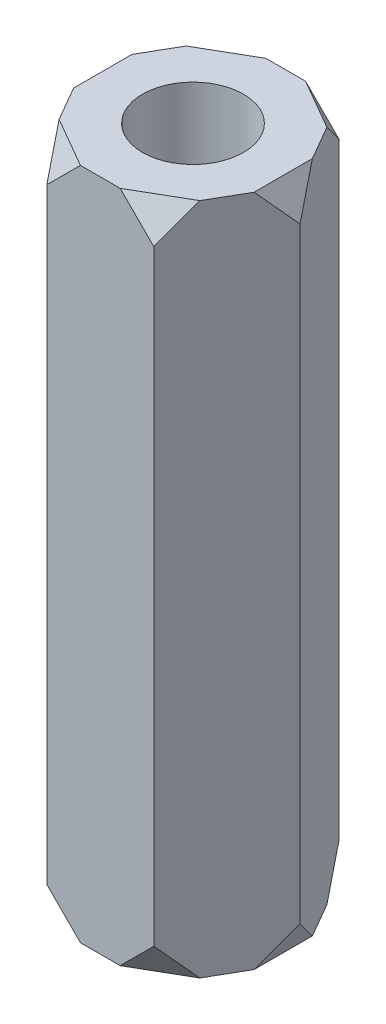
ISO-10303-21;
HEADER;
FILE_DESCRIPTION(('STEP AP214'),'2;1');
FILE_NAME('part.step','',(''),(''),'','','');
FILE_SCHEMA(('AUTOMOTIVE_DESIGN { 1 0 10303 214 1 1 1 1 }'));
ENDSEC;
DATA;
#1=APPLICATION_CONTEXT('core data for automotive mechanical design processes');
#2=APPLICATION_PROTOCOL_DEFINITION('international standard','automotive_design',2000,#1);
#3=PRODUCT_CONTEXT('',#1,'mechanical');
#4=PRODUCT('Part','Part','',(#3));
#5=PRODUCT_RELATED_PRODUCT_CATEGORY('part','',(#4));
#6=PRODUCT_DEFINITION_FORMATION('','',#4);
#7=PRODUCT_DEFINITION_CONTEXT('part definition',#1,'design');
#8=PRODUCT_DEFINITION('design','',#6,#7);
#9=PRODUCT_DEFINITION_SHAPE('','',#8);
#10=(LENGTH_UNIT() NAMED_UNIT(*) SI_UNIT(.MILLI.,.METRE.));
#11=(NAMED_UNIT(*) PLANE_ANGLE_UNIT() SI_UNIT($,.RADIAN.));
#12=(NAMED_UNIT(*) SI_UNIT($,.STERADIAN.) SOLID_ANGLE_UNIT());
#13=UNCERTAINTY_MEASURE_WITH_UNIT(LENGTH_MEASURE(1.E-05),#10,'distance_accuracy_value','');
#14=(GEOMETRIC_REPRESENTATION_CONTEXT(3) GLOBAL_UNCERTAINTY_ASSIGNED_CONTEXT((#13)) GLOBAL_UNIT_ASSIGNED_CONTEXT((#10,
#11,#12)) REPRESENTATION_CONTEXT('',''));
#15=CARTESIAN_POINT('',(0.,0.,0.));
#16=DIRECTION('',(0.,0.,1.));
#17=DIRECTION('',(1.,0.,0.));
#18=AXIS2_PLACEMENT_3D('',#15,#16,#17);
#19=CARTESIAN_POINT('',(1.59000000000003,20.,2.7539607840345));
#20=DIRECTION('',(-0.866025403784442,0.,-0.499999999999995));
#21=DIRECTION('',(-0.499999999999995,0.,0.866025403784442));
#22=AXIS2_PLACEMENT_3D('',#19,#20,#21);
#23=PLANE('',#22);
#24=DIRECTION('',(0.353553390593275,-0.707106781186547,-0.612372435695794));
#25=VECTOR('',#24,1.);
#26=CARTESIAN_POINT('',(1.83999999999999,0.5,2.3209480821423));
#27=LINE('',#26,#25);
#28=CARTESIAN_POINT('',(1.58999999999999,1.,2.75396078403452));
#29=VERTEX_POINT('',#28);
#30=CARTESIAN_POINT('',(2.09,0.,1.88793538025008));
#31=VERTEX_POINT('',#30);
#32=EDGE_CURVE('E279',#29,#31,#27,.T.);
#33=ORIENTED_EDGE('',*,*,#32,.T.);
#34=DIRECTION('',(0.499999999999995,0.,-0.866025403784441));
#35=VECTOR('',#34,1.);
#36=CARTESIAN_POINT('',(1.59000000000003,0.,2.7539607840345));
#37=LINE('',#36,#35);
#38=CARTESIAN_POINT('',(2.68,0.,0.866025403784454));
#39=VERTEX_POINT('',#38);
#40=EDGE_CURVE('E253',#31,#39,#37,.T.);
#41=ORIENTED_EDGE('',*,*,#40,.T.);
#42=DIRECTION('',(0.353553390593274,0.707106781186548,-0.612372435695794));
#43=VECTOR('',#42,1.);
#44=CARTESIAN_POINT('',(2.135,-1.09,1.80999309390948));
#45=LINE('',#44,#43);
#46=CARTESIAN_POINT('',(3.18,1.,0.));
#47=VERTEX_POINT('',#46);
#48=EDGE_CURVE('E433',#39,#47,#45,.T.);
#49=ORIENTED_EDGE('',*,*,#48,.T.);
#50=DIRECTION('',(0.,-1.,0.));
#51=VECTOR('',#50,1.);
#52=CARTESIAN_POINT('',(3.18,20.,0.));
#53=LINE('',#52,#51);
#54=CARTESIAN_POINT('',(3.18,19.,0.));
#55=VERTEX_POINT('',#54);
#56=EDGE_CURVE('E208',#55,#47,#53,.T.);
#57=ORIENTED_EDGE('',*,*,#56,.F.);
#58=DIRECTION('',(0.353553390593274,-0.707106781186548,-0.612372435695794));
#59=VECTOR('',#58,1.);
#60=CARTESIAN_POINT('',(2.135,21.09,1.80999309390948));
#61=LINE('',#60,#59);
#62=CARTESIAN_POINT('',(2.68,20.,0.866025403784437));
#63=VERTEX_POINT('',#62);
#64=EDGE_CURVE('E336',#63,#55,#61,.T.);
#65=ORIENTED_EDGE('',*,*,#64,.F.);
#66=DIRECTION('',(0.499999999999995,0.,-0.866025403784441));
#67=VECTOR('',#66,1.);
#68=CARTESIAN_POINT('',(1.59000000000003,20.,2.7539607840345));
#69=LINE('',#68,#67);
#70=CARTESIAN_POINT('',(2.09,20.,1.88793538025008));
#71=VERTEX_POINT('',#70);
#72=EDGE_CURVE('E273',#71,#63,#69,.T.);
#73=ORIENTED_EDGE('',*,*,#72,.F.);
#74=DIRECTION('',(0.353553390593275,0.707106781186547,-0.612372435695794));
#75=VECTOR('',#74,1.);
#76=CARTESIAN_POINT('',(1.83999999999999,19.5,2.3209480821423));
#77=LINE('',#76,#75);
#78=CARTESIAN_POINT('',(1.58999999999999,19.,2.75396078403452));
#79=VERTEX_POINT('',#78);
#80=EDGE_CURVE('E282',#79,#71,#77,.T.);
#81=ORIENTED_EDGE('',*,*,#80,.F.);
#82=DIRECTION('',(0.,-1.,0.));
#83=VECTOR('',#82,1.);
#84=CARTESIAN_POINT('',(1.59000000000003,20.,2.7539607840345));
#85=LINE('',#84,#83);
#86=EDGE_CURVE('E201',#79,#29,#85,.T.);
#87=ORIENTED_EDGE('',*,*,#86,.T.);
#88=EDGE_LOOP('',(#33,#41,#49,#57,#65,#73,#81,#87));
#89=FACE_BOUND('',#88,.T.);
#90=ADVANCED_FACE('F39',(#89),#23,.F.);
#91=CARTESIAN_POINT('',(3.18,20.,0.));
#92=DIRECTION('',(-0.866025403784438,0.,0.500000000000001));
#93=DIRECTION('',(0.500000000000001,0.,0.866025403784438));
#94=AXIS2_PLACEMENT_3D('',#91,#92,#93);
#95=PLANE('',#94);
#96=DIRECTION('',(-0.353553390593274,-0.707106781186547,-0.612372435695794));
#97=VECTOR('',#96,1.);
#98=CARTESIAN_POINT('',(2.93,0.5,-0.433012701892221));
#99=LINE('',#98,#97);
#100=CARTESIAN_POINT('',(2.68,0.,-0.866025403784441));
#101=VERTEX_POINT('',#100);
#102=EDGE_CURVE('E434',#47,#101,#99,.T.);
#103=ORIENTED_EDGE('',*,*,#102,.T.);
#104=DIRECTION('',(-0.500000000000001,0.,-0.866025403784438));
#105=VECTOR('',#104,1.);
#106=CARTESIAN_POINT('',(3.18,0.,0.));
#107=LINE('',#106,#105);
#108=CARTESIAN_POINT('',(2.08999999999999,0.,-1.88793538025009));
#109=VERTEX_POINT('',#108);
#110=EDGE_CURVE('E257',#101,#109,#107,.T.);
#111=ORIENTED_EDGE('',*,*,#110,.T.);
#112=DIRECTION('',(-0.353553390593279,0.707106781186548,-0.612372435695791));
#113=VECTOR('',#112,1.);
#114=CARTESIAN_POINT('',(2.63499999999999,-1.09,-0.943967690125059));
#115=LINE('',#114,#113);
#116=CARTESIAN_POINT('',(1.58999999999997,1.,-2.75396078403453));
#117=VERTEX_POINT('',#116);
#118=EDGE_CURVE('E54',#109,#117,#115,.T.);
#119=ORIENTED_EDGE('',*,*,#118,.T.);
#120=DIRECTION('',(0.,-1.,0.));
#121=VECTOR('',#120,1.);
#122=CARTESIAN_POINT('',(1.58999999999999,20.,-2.75396078403452));
#123=LINE('',#122,#121);
#124=CARTESIAN_POINT('',(1.58999999999999,19.,-2.75396078403452));
#125=VERTEX_POINT('',#124);
#126=EDGE_CURVE('E198',#125,#117,#123,.T.);
#127=ORIENTED_EDGE('',*,*,#126,.F.);
#128=DIRECTION('',(-0.353553390593279,-0.707106781186548,-0.612372435695791));
#129=VECTOR('',#128,1.);
#130=CARTESIAN_POINT('',(2.63499999999999,21.09,-0.943967690125059));
#131=LINE('',#130,#129);
#132=CARTESIAN_POINT('',(2.08999999999998,20.,-1.8879353802501));
#133=VERTEX_POINT('',#132);
#134=EDGE_CURVE('E326',#133,#125,#131,.T.);
#135=ORIENTED_EDGE('',*,*,#134,.F.);
#136=DIRECTION('',(-0.500000000000001,0.,-0.866025403784438));
#137=VECTOR('',#136,1.);
#138=CARTESIAN_POINT('',(3.18,20.,0.));
#139=LINE('',#138,#137);
#140=CARTESIAN_POINT('',(2.68,20.,-0.866025403784441));
#141=VERTEX_POINT('',#140);
#142=EDGE_CURVE('E356',#141,#133,#139,.T.);
#143=ORIENTED_EDGE('',*,*,#142,.F.);
#144=DIRECTION('',(-0.353553390593274,0.707106781186547,-0.612372435695794));
#145=VECTOR('',#144,1.);
#146=CARTESIAN_POINT('',(2.93,19.5,-0.433012701892221));
#147=LINE('',#146,#145);
#148=EDGE_CURVE('E327',#55,#141,#147,.T.);
#149=ORIENTED_EDGE('',*,*,#148,.F.);
#150=ORIENTED_EDGE('',*,*,#56,.T.);
#151=EDGE_LOOP('',(#103,#111,#119,#127,#135,#143,#149,#150));
#152=FACE_BOUND('',#151,.T.);
#153=ADVANCED_FACE('F388',(#152),#95,.F.);
#154=CARTESIAN_POINT('',(1.58999999999999,20.,-2.75396078403452));
#155=DIRECTION('',(0.,0.,1.));
#156=DIRECTION('',(1.,0.,0.));
#157=AXIS2_PLACEMENT_3D('',#154,#155,#156);
#158=PLANE('',#157);
#159=DIRECTION('',(-0.707106781186548,-0.707106781186547,0.));
#160=VECTOR('',#159,1.);
#161=CARTESIAN_POINT('',(1.08999999999997,0.5,-2.75396078403452));
#162=LINE('',#161,#160);
#163=CARTESIAN_POINT('',(0.589999999999971,0.,-2.75396078403452));
#164=VERTEX_POINT('',#163);
#165=EDGE_CURVE('E445',#117,#164,#162,.T.);
#166=ORIENTED_EDGE('',*,*,#165,.T.);
#167=DIRECTION('',(-1.,0.,0.));
#168=VECTOR('',#167,1.);
#169=CARTESIAN_POINT('',(1.58999999999999,0.,-2.75396078403452));
#170=LINE('',#169,#168);
#171=CARTESIAN_POINT('',(-0.590000000000014,0.,-2.75396078403451));
#172=VERTEX_POINT('',#171);
#173=EDGE_CURVE('E262',#164,#172,#170,.T.);
#174=ORIENTED_EDGE('',*,*,#173,.T.);
#175=DIRECTION('',(-0.707106781186547,0.707106781186548,0.));
#176=VECTOR('',#175,1.);
#177=CARTESIAN_POINT('',(0.49999999999999,-1.09,-2.75396078403451));
#178=LINE('',#177,#176);
#179=CARTESIAN_POINT('',(-1.59000000000001,1.,-2.75396078403451));
#180=VERTEX_POINT('',#179);
#181=EDGE_CURVE('E62',#172,#180,#178,.T.);
#182=ORIENTED_EDGE('',*,*,#181,.T.);
#183=DIRECTION('',(0.,-1.,0.));
#184=VECTOR('',#183,1.);
#185=CARTESIAN_POINT('',(-1.59000000000001,20.,-2.75396078403451));
#186=LINE('',#185,#184);
#187=CARTESIAN_POINT('',(-1.59000000000001,19.,-2.75396078403451));
#188=VERTEX_POINT('',#187);
#189=EDGE_CURVE('E192',#188,#180,#186,.T.);
#190=ORIENTED_EDGE('',*,*,#189,.F.);
#191=DIRECTION('',(-0.707106781186547,-0.707106781186548,0.));
#192=VECTOR('',#191,1.);
#193=CARTESIAN_POINT('',(0.49999999999999,21.09,-2.75396078403451));
#194=LINE('',#193,#192);
#195=CARTESIAN_POINT('',(-0.590000000000014,20.,-2.75396078403451));
#196=VERTEX_POINT('',#195);
#197=EDGE_CURVE('E316',#196,#188,#194,.T.);
#198=ORIENTED_EDGE('',*,*,#197,.F.);
#199=DIRECTION('',(-1.,0.,0.));
#200=VECTOR('',#199,1.);
#201=CARTESIAN_POINT('',(1.58999999999999,20.,-2.75396078403452));
#202=LINE('',#201,#200);
#203=CARTESIAN_POINT('',(0.589999999999971,20.,-2.75396078403452));
#204=VERTEX_POINT('',#203);
#205=EDGE_CURVE('E249',#204,#196,#202,.T.);
#206=ORIENTED_EDGE('',*,*,#205,.F.);
#207=DIRECTION('',(-0.707106781186548,0.707106781186547,0.));
#208=VECTOR('',#207,1.);
#209=CARTESIAN_POINT('',(1.08999999999997,19.5,-2.75396078403452));
#210=LINE('',#209,#208);
#211=EDGE_CURVE('E317',#125,#204,#210,.T.);
#212=ORIENTED_EDGE('',*,*,#211,.F.);
#213=ORIENTED_EDGE('',*,*,#126,.T.);
#214=EDGE_LOOP('',(#166,#174,#182,#190,#198,#206,#212,#213));
#215=FACE_BOUND('',#214,.T.);
#216=ADVANCED_FACE('F367',(#215),#158,.F.);
#217=CARTESIAN_POINT('',(-1.59000000000001,20.,-2.75396078403451));
#218=DIRECTION('',(0.866025403784442,0.,0.499999999999995));
#219=DIRECTION('',(0.499999999999995,0.,-0.866025403784442));
#220=AXIS2_PLACEMENT_3D('',#217,#218,#219);
#221=PLANE('',#220);
#222=DIRECTION('',(-0.35355339059327,-0.707106781186547,0.612372435695797));
#223=VECTOR('',#222,1.);
#224=CARTESIAN_POINT('',(-1.84000000000001,0.5,-2.32094808214229));
#225=LINE('',#224,#223);
#226=CARTESIAN_POINT('',(-2.09000000000001,0.,-1.88793538025006));
#227=VERTEX_POINT('',#226);
#228=EDGE_CURVE('E448',#180,#227,#225,.T.);
#229=ORIENTED_EDGE('',*,*,#228,.T.);
#230=DIRECTION('',(-0.499999999999995,0.,0.866025403784442));
#231=VECTOR('',#230,1.);
#232=CARTESIAN_POINT('',(-1.59000000000001,0.,-2.75396078403451));
#233=LINE('',#232,#231);
#234=CARTESIAN_POINT('',(-2.68,0.,-0.866025403784421));
#235=VERTEX_POINT('',#234);
#236=EDGE_CURVE('E184',#227,#235,#233,.T.);
#237=ORIENTED_EDGE('',*,*,#236,.T.);
#238=DIRECTION('',(-0.35355339059327,0.707106781186548,0.612372435695796));
#239=VECTOR('',#238,1.);
#240=CARTESIAN_POINT('',(-2.13500000000001,-1.09,-1.80999309390946));
#241=LINE('',#240,#239);
#242=CARTESIAN_POINT('',(-3.18,1.,0.));
#243=VERTEX_POINT('',#242);
#244=EDGE_CURVE('E166',#235,#243,#241,.T.);
#245=ORIENTED_EDGE('',*,*,#244,.T.);
#246=DIRECTION('',(0.,-1.,0.));
#247=VECTOR('',#246,1.);
#248=CARTESIAN_POINT('',(-3.18,20.,0.));
#249=LINE('',#248,#247);
#250=CARTESIAN_POINT('',(-3.18,19.,0.));
#251=VERTEX_POINT('',#250);
#252=EDGE_CURVE('E182',#251,#243,#249,.T.);
#253=ORIENTED_EDGE('',*,*,#252,.F.);
#254=DIRECTION('',(-0.35355339059327,-0.707106781186548,0.612372435695796));
#255=VECTOR('',#254,1.);
#256=CARTESIAN_POINT('',(-2.13500000000001,21.09,-1.80999309390946));
#257=LINE('',#256,#255);
#258=CARTESIAN_POINT('',(-2.68000000000001,20.,-0.866025403784419));
#259=VERTEX_POINT('',#258);
#260=EDGE_CURVE('E305',#259,#251,#257,.T.);
#261=ORIENTED_EDGE('',*,*,#260,.F.);
#262=DIRECTION('',(-0.499999999999995,0.,0.866025403784442));
#263=VECTOR('',#262,1.);
#264=CARTESIAN_POINT('',(-1.59000000000001,20.,-2.75396078403451));
#265=LINE('',#264,#263);
#266=CARTESIAN_POINT('',(-2.09000000000001,20.,-1.88793538025006));
#267=VERTEX_POINT('',#266);
#268=EDGE_CURVE('E246',#267,#259,#265,.T.);
#269=ORIENTED_EDGE('',*,*,#268,.F.);
#270=DIRECTION('',(-0.35355339059327,0.707106781186547,0.612372435695797));
#271=VECTOR('',#270,1.);
#272=CARTESIAN_POINT('',(-1.84000000000001,19.5,-2.32094808214229));
#273=LINE('',#272,#271);
#274=EDGE_CURVE('E306',#188,#267,#273,.T.);
#275=ORIENTED_EDGE('',*,*,#274,.F.);
#276=ORIENTED_EDGE('',*,*,#189,.T.);
#277=EDGE_LOOP('',(#229,#237,#245,#253,#261,#269,#275,#276));
#278=FACE_BOUND('',#277,.T.);
#279=ADVANCED_FACE('F180',(#278),#221,.F.);
#280=CARTESIAN_POINT('',(-3.18,20.,0.));
#281=DIRECTION('',(0.866025403784435,0.,-0.500000000000007));
#282=DIRECTION('',(-0.500000000000007,0.,-0.866025403784435));
#283=AXIS2_PLACEMENT_3D('',#280,#281,#282);
#284=PLANE('',#283);
#285=DIRECTION('',(0.353553390593279,-0.707106781186547,0.612372435695792));
#286=VECTOR('',#285,1.);
#287=CARTESIAN_POINT('',(-2.93,0.5,0.433012701892241));
#288=LINE('',#287,#286);
#289=CARTESIAN_POINT('',(-2.67999999999999,0.,0.86602540378446));
#290=VERTEX_POINT('',#289);
#291=EDGE_CURVE('E163',#243,#290,#288,.T.);
#292=ORIENTED_EDGE('',*,*,#291,.T.);
#293=DIRECTION('',(0.500000000000007,0.,0.866025403784435));
#294=VECTOR('',#293,1.);
#295=CARTESIAN_POINT('',(-3.18,0.,0.));
#296=LINE('',#295,#294);
#297=CARTESIAN_POINT('',(-2.08999999999998,0.,1.88793538025009));
#298=VERTEX_POINT('',#297);
#299=EDGE_CURVE('E268',#290,#298,#296,.T.);
#300=ORIENTED_EDGE('',*,*,#299,.T.);
#301=DIRECTION('',(0.353553390593279,0.707106781186548,0.612372435695791));
#302=VECTOR('',#301,1.);
#303=CARTESIAN_POINT('',(-2.63499999999999,-1.09,0.943967690125059));
#304=LINE('',#303,#302);
#305=CARTESIAN_POINT('',(-1.58999999999997,1.,2.75396078403453));
#306=VERTEX_POINT('',#305);
#307=EDGE_CURVE('E224',#298,#306,#304,.T.);
#308=ORIENTED_EDGE('',*,*,#307,.T.);
#309=DIRECTION('',(0.,-1.,0.));
#310=VECTOR('',#309,1.);
#311=CARTESIAN_POINT('',(-1.58999999999997,20.,2.75396078403453));
#312=LINE('',#311,#310);
#313=CARTESIAN_POINT('',(-1.58999999999997,19.,2.75396078403453));
#314=VERTEX_POINT('',#313);
#315=EDGE_CURVE('E193',#314,#306,#312,.T.);
#316=ORIENTED_EDGE('',*,*,#315,.F.);
#317=DIRECTION('',(0.353553390593279,-0.707106781186548,0.612372435695791));
#318=VECTOR('',#317,1.);
#319=CARTESIAN_POINT('',(-2.63499999999999,21.09,0.943967690125059));
#320=LINE('',#319,#318);
#321=CARTESIAN_POINT('',(-2.08999999999998,20.,1.8879353802501));
#322=VERTEX_POINT('',#321);
#323=EDGE_CURVE('E47',#322,#314,#320,.T.);
#324=ORIENTED_EDGE('',*,*,#323,.F.);
#325=DIRECTION('',(0.500000000000007,0.,0.866025403784435));
#326=VECTOR('',#325,1.);
#327=CARTESIAN_POINT('',(-3.18,20.,0.));
#328=LINE('',#327,#326);
#329=CARTESIAN_POINT('',(-2.67999999999999,20.,0.86602540378446));
#330=VERTEX_POINT('',#329);
#331=EDGE_CURVE('E222',#330,#322,#328,.T.);
#332=ORIENTED_EDGE('',*,*,#331,.F.);
#333=DIRECTION('',(0.353553390593279,0.707106781186547,0.612372435695792));
#334=VECTOR('',#333,1.);
#335=CARTESIAN_POINT('',(-2.93,19.5,0.433012701892241));
#336=LINE('',#335,#334);
#337=EDGE_CURVE('E190',#251,#330,#336,.T.);
#338=ORIENTED_EDGE('',*,*,#337,.F.);
#339=ORIENTED_EDGE('',*,*,#252,.T.);
#340=EDGE_LOOP('',(#292,#300,#308,#316,#324,#332,#338,#339));
#341=FACE_BOUND('',#340,.T.);
#342=ADVANCED_FACE('F188',(#341),#284,.F.);
#343=CARTESIAN_POINT('',(-1.58999999999997,20.,2.75396078403453));
#344=DIRECTION('',(0.,0.,-1.));
#345=DIRECTION('',(-1.,0.,0.));
#346=AXIS2_PLACEMENT_3D('',#343,#344,#345);
#347=PLANE('',#346);
#348=DIRECTION('',(0.707106781186547,0.707106781186548,0.));
#349=VECTOR('',#348,1.);
#350=CARTESIAN_POINT('',(-0.500000000000009,-1.09,2.75396078403451));
#351=LINE('',#350,#349);
#352=CARTESIAN_POINT('',(0.590000000000009,0.,2.75396078403451));
#353=VERTEX_POINT('',#352);
#354=EDGE_CURVE('E283',#353,#29,#351,.T.);
#355=ORIENTED_EDGE('',*,*,#354,.T.);
#356=ORIENTED_EDGE('',*,*,#86,.F.);
#357=DIRECTION('',(0.707106781186547,-0.707106781186548,0.));
#358=VECTOR('',#357,1.);
#359=CARTESIAN_POINT('',(-0.500000000000009,21.09,2.75396078403451));
#360=LINE('',#359,#358);
#361=CARTESIAN_POINT('',(0.590000000000006,20.,2.75396078403451));
#362=VERTEX_POINT('',#361);
#363=EDGE_CURVE('E236',#362,#79,#360,.T.);
#364=ORIENTED_EDGE('',*,*,#363,.F.);
#365=DIRECTION('',(1.,0.,0.));
#366=VECTOR('',#365,1.);
#367=CARTESIAN_POINT('',(-1.58999999999997,20.,2.75396078403453));
#368=LINE('',#367,#366);
#369=CARTESIAN_POINT('',(-0.589999999999971,20.,2.75396078403452));
#370=VERTEX_POINT('',#369);
#371=EDGE_CURVE('E234',#370,#362,#368,.T.);
#372=ORIENTED_EDGE('',*,*,#371,.F.);
#373=DIRECTION('',(0.707106781186548,0.707106781186547,0.));
#374=VECTOR('',#373,1.);
#375=CARTESIAN_POINT('',(-1.08999999999997,19.5,2.75396078403452));
#376=LINE('',#375,#374);
#377=EDGE_CURVE('E11',#314,#370,#376,.T.);
#378=ORIENTED_EDGE('',*,*,#377,.F.);
#379=ORIENTED_EDGE('',*,*,#315,.T.);
#380=DIRECTION('',(0.707106781186548,-0.707106781186547,0.));
#381=VECTOR('',#380,1.);
#382=CARTESIAN_POINT('',(-1.08999999999997,0.5,2.75396078403452));
#383=LINE('',#382,#381);
#384=CARTESIAN_POINT('',(-0.589999999999971,0.,2.75396078403452));
#385=VERTEX_POINT('',#384);
#386=EDGE_CURVE('E230',#306,#385,#383,.T.);
#387=ORIENTED_EDGE('',*,*,#386,.T.);
#388=DIRECTION('',(1.,0.,0.));
#389=VECTOR('',#388,1.);
#390=CARTESIAN_POINT('',(-1.58999999999997,0.,2.75396078403453));
#391=LINE('',#390,#389);
#392=EDGE_CURVE('E271',#385,#353,#391,.T.);
#393=ORIENTED_EDGE('',*,*,#392,.T.);
#394=EDGE_LOOP('',(#355,#356,#364,#372,#378,#379,#387,#393));
#395=FACE_BOUND('',#394,.T.);
#396=ADVANCED_FACE('F228',(#395),#347,.F.);
#397=CARTESIAN_POINT('',(0.,0.,0.));
#398=DIRECTION('',(0.,1.,0.));
#399=DIRECTION('',(0.,0.,1.));
#400=AXIS2_PLACEMENT_3D('',#397,#398,#399);
#401=PLANE('',#400);
#402=CARTESIAN_POINT('',(0.,0.,0.));
#403=DIRECTION('',(0.,1.,0.));
#404=DIRECTION('',(0.,0.,1.));
#405=AXIS2_PLACEMENT_3D('',#402,#403,#404);
#406=CIRCLE('',#405,1.5);
#407=CARTESIAN_POINT('',(0.,0.,1.5));
#408=VERTEX_POINT('',#407);
#409=EDGE_CURVE('E311',#408,#408,#406,.T.);
#410=ORIENTED_EDGE('',*,*,#409,.T.);
#411=EDGE_LOOP('',(#410));
#412=FACE_BOUND('',#411,.T.);
#413=DIRECTION('',(0.86602540378444,0.,-0.499999999999998));
#414=VECTOR('',#413,1.);
#415=CARTESIAN_POINT('',(1.33999999999999,0.,2.3209480821423));
#416=LINE('',#415,#414);
#417=EDGE_CURVE('E287',#353,#31,#416,.T.);
#418=ORIENTED_EDGE('',*,*,#417,.F.);
#419=ORIENTED_EDGE('',*,*,#392,.F.);
#420=DIRECTION('',(0.866025403784443,0.,0.499999999999992));
#421=VECTOR('',#420,1.);
#422=CARTESIAN_POINT('',(-1.33999999999998,0.,2.32094808214231));
#423=LINE('',#422,#421);
#424=EDGE_CURVE('E174',#298,#385,#423,.T.);
#425=ORIENTED_EDGE('',*,*,#424,.F.);
#426=ORIENTED_EDGE('',*,*,#299,.F.);
#427=DIRECTION('',(0.,0.,1.));
#428=VECTOR('',#427,1.);
#429=CARTESIAN_POINT('',(-2.68,0.,0.));
#430=LINE('',#429,#428);
#431=EDGE_CURVE('E168',#235,#290,#430,.T.);
#432=ORIENTED_EDGE('',*,*,#431,.F.);
#433=ORIENTED_EDGE('',*,*,#236,.F.);
#434=DIRECTION('',(-0.866025403784436,0.,0.500000000000004));
#435=VECTOR('',#434,1.);
#436=CARTESIAN_POINT('',(-1.34000000000001,0.,-2.32094808214229));
#437=LINE('',#436,#435);
#438=EDGE_CURVE('E453',#172,#227,#437,.T.);
#439=ORIENTED_EDGE('',*,*,#438,.F.);
#440=ORIENTED_EDGE('',*,*,#173,.F.);
#441=DIRECTION('',(-0.866025403784443,0.,-0.499999999999992));
#442=VECTOR('',#441,1.);
#443=CARTESIAN_POINT('',(1.33999999999998,0.,-2.32094808214231));
#444=LINE('',#443,#442);
#445=EDGE_CURVE('E438',#109,#164,#444,.T.);
#446=ORIENTED_EDGE('',*,*,#445,.F.);
#447=ORIENTED_EDGE('',*,*,#110,.F.);
#448=DIRECTION('',(0.,0.,-1.));
#449=VECTOR('',#448,1.);
#450=CARTESIAN_POINT('',(2.68,0.,0.));
#451=LINE('',#450,#449);
#452=EDGE_CURVE('E291',#39,#101,#451,.T.);
#453=ORIENTED_EDGE('',*,*,#452,.F.);
#454=ORIENTED_EDGE('',*,*,#40,.F.);
#455=EDGE_LOOP('',(#418,#419,#425,#426,#432,#433,#439,#440,#446,#447,#453,#454));
#456=FACE_BOUND('',#455,.T.);
#457=ADVANCED_FACE('F405',(#412,#456),#401,.F.);
#458=CARTESIAN_POINT('',(0.,20.,0.));
#459=DIRECTION('',(0.,1.,0.));
#460=DIRECTION('',(0.,0.,1.));
#461=AXIS2_PLACEMENT_3D('',#458,#459,#460);
#462=PLANE('',#461);
#463=CARTESIAN_POINT('',(0.,20.,0.));
#464=DIRECTION('',(0.,1.,0.));
#465=DIRECTION('',(0.,0.,1.));
#466=AXIS2_PLACEMENT_3D('',#463,#464,#465);
#467=CIRCLE('',#466,1.5);
#468=CARTESIAN_POINT('',(0.,20.,1.5));
#469=VERTEX_POINT('',#468);
#470=EDGE_CURVE('E258',#469,#469,#467,.T.);
#471=ORIENTED_EDGE('',*,*,#470,.F.);
#472=EDGE_LOOP('',(#471));
#473=FACE_BOUND('',#472,.T.);
#474=ORIENTED_EDGE('',*,*,#268,.T.);
#475=DIRECTION('',(0.,0.,1.));
#476=VECTOR('',#475,1.);
#477=CARTESIAN_POINT('',(-2.68,20.,0.));
#478=LINE('',#477,#476);
#479=EDGE_CURVE('E244',#259,#330,#478,.T.);
#480=ORIENTED_EDGE('',*,*,#479,.T.);
#481=ORIENTED_EDGE('',*,*,#331,.T.);
#482=DIRECTION('',(0.866025403784443,0.,0.499999999999992));
#483=VECTOR('',#482,1.);
#484=CARTESIAN_POINT('',(-1.33999999999998,20.,2.32094808214231));
#485=LINE('',#484,#483);
#486=EDGE_CURVE('E212',#322,#370,#485,.T.);
#487=ORIENTED_EDGE('',*,*,#486,.T.);
#488=ORIENTED_EDGE('',*,*,#371,.T.);
#489=DIRECTION('',(0.86602540378444,0.,-0.499999999999998));
#490=VECTOR('',#489,1.);
#491=CARTESIAN_POINT('',(1.33999999999999,20.,2.3209480821423));
#492=LINE('',#491,#490);
#493=EDGE_CURVE('E302',#362,#71,#492,.T.);
#494=ORIENTED_EDGE('',*,*,#493,.T.);
#495=ORIENTED_EDGE('',*,*,#72,.T.);
#496=DIRECTION('',(0.,0.,-1.));
#497=VECTOR('',#496,1.);
#498=CARTESIAN_POINT('',(2.68,20.,0.));
#499=LINE('',#498,#497);
#500=EDGE_CURVE('E332',#63,#141,#499,.T.);
#501=ORIENTED_EDGE('',*,*,#500,.T.);
#502=ORIENTED_EDGE('',*,*,#142,.T.);
#503=DIRECTION('',(-0.866025403784443,0.,-0.499999999999992));
#504=VECTOR('',#503,1.);
#505=CARTESIAN_POINT('',(1.33999999999998,20.,-2.32094808214231));
#506=LINE('',#505,#504);
#507=EDGE_CURVE('E322',#133,#204,#506,.T.);
#508=ORIENTED_EDGE('',*,*,#507,.T.);
#509=ORIENTED_EDGE('',*,*,#205,.T.);
#510=DIRECTION('',(-0.866025403784436,0.,0.500000000000004));
#511=VECTOR('',#510,1.);
#512=CARTESIAN_POINT('',(-1.34000000000001,20.,-2.32094808214229));
#513=LINE('',#512,#511);
#514=EDGE_CURVE('E312',#196,#267,#513,.T.);
#515=ORIENTED_EDGE('',*,*,#514,.T.);
#516=EDGE_LOOP('',(#474,#480,#481,#487,#488,#494,#495,#501,#502,#508,#509,#515));
#517=FACE_BOUND('',#516,.T.);
#518=ADVANCED_FACE('F242',(#473,#517),#462,.T.);
#519=CARTESIAN_POINT('',(0.,20.,0.));
#520=DIRECTION('',(0.,-1.,0.));
#521=DIRECTION('',(0.,0.,-1.));
#522=AXIS2_PLACEMENT_3D('',#519,#520,#521);
#523=CYLINDRICAL_SURFACE('',#522,1.5);
#524=ORIENTED_EDGE('',*,*,#470,.T.);
#525=EDGE_LOOP('',(#524));
#526=FACE_BOUND('',#525,.T.);
#527=ORIENTED_EDGE('',*,*,#409,.F.);
#528=EDGE_LOOP('',(#527));
#529=FACE_BOUND('',#528,.T.);
#530=ADVANCED_FACE('F411',(#526,#529),#523,.F.);
#531=CARTESIAN_POINT('',(-5.07199999999992,5.07200000000001,8.7849616959894));
#532=DIRECTION('',(-0.44721359549995,0.447213595499959,0.774596669241487));
#533=DIRECTION('',(0.,-0.86602540378444,0.499999999999999));
#534=AXIS2_PLACEMENT_3D('',#531,#532,#533);
#535=PLANE('',#534);
#536=ORIENTED_EDGE('',*,*,#486,.F.);
#537=ORIENTED_EDGE('',*,*,#323,.T.);
#538=ORIENTED_EDGE('',*,*,#377,.T.);
#539=EDGE_LOOP('',(#536,#537,#538));
#540=FACE_BOUND('',#539,.T.);
#541=ADVANCED_FACE('F220',(#540),#535,.T.);
#542=CARTESIAN_POINT('',(5.07199999999998,5.07200000000001,8.78496169598936));
#543=DIRECTION('',(0.447213595499956,0.447213595499959,0.774596669241484));
#544=DIRECTION('',(0.433012701892215,-0.86602540378444,0.250000000000004));
#545=AXIS2_PLACEMENT_3D('',#542,#543,#544);
#546=PLANE('',#545);
#547=ORIENTED_EDGE('',*,*,#493,.F.);
#548=ORIENTED_EDGE('',*,*,#363,.T.);
#549=ORIENTED_EDGE('',*,*,#80,.T.);
#550=EDGE_LOOP('',(#547,#548,#549));
#551=FACE_BOUND('',#550,.T.);
#552=ADVANCED_FACE('F376',(#551),#546,.T.);
#553=CARTESIAN_POINT('',(-10.144,5.07200000000001,0.));
#554=DIRECTION('',(-0.894427190999916,0.447213595499959,0.));
#555=DIRECTION('',(-0.433012701892219,-0.86602540378444,0.249999999999998));
#556=AXIS2_PLACEMENT_3D('',#553,#554,#555);
#557=PLANE('',#556);
#558=ORIENTED_EDGE('',*,*,#479,.F.);
#559=ORIENTED_EDGE('',*,*,#260,.T.);
#560=ORIENTED_EDGE('',*,*,#337,.T.);
#561=EDGE_LOOP('',(#558,#559,#560));
#562=FACE_BOUND('',#561,.T.);
#563=ADVANCED_FACE('F374',(#562),#557,.T.);
#564=CARTESIAN_POINT('',(-5.07200000000005,5.07200000000001,-8.78496169598933));
#565=DIRECTION('',(-0.447213595499962,0.447213595499959,-0.774596669241481));
#566=DIRECTION('',(-0.433012701892217,-0.86602540378444,-0.250000000000001));
#567=AXIS2_PLACEMENT_3D('',#564,#565,#566);
#568=PLANE('',#567);
#569=ORIENTED_EDGE('',*,*,#514,.F.);
#570=ORIENTED_EDGE('',*,*,#197,.T.);
#571=ORIENTED_EDGE('',*,*,#274,.T.);
#572=EDGE_LOOP('',(#569,#570,#571));
#573=FACE_BOUND('',#572,.T.);
#574=ADVANCED_FACE('F372',(#573),#568,.T.);
#575=CARTESIAN_POINT('',(5.07199999999992,5.07200000000001,-8.7849616959894));
#576=DIRECTION('',(0.44721359549995,0.447213595499959,-0.774596669241487));
#577=DIRECTION('',(0.,-0.86602540378444,-0.499999999999999));
#578=AXIS2_PLACEMENT_3D('',#575,#576,#577);
#579=PLANE('',#578);
#580=ORIENTED_EDGE('',*,*,#507,.F.);
#581=ORIENTED_EDGE('',*,*,#134,.T.);
#582=ORIENTED_EDGE('',*,*,#211,.T.);
#583=EDGE_LOOP('',(#580,#581,#582));
#584=FACE_BOUND('',#583,.T.);
#585=ADVANCED_FACE('F382',(#584),#579,.T.);
#586=CARTESIAN_POINT('',(10.144,5.07200000000001,0.));
#587=DIRECTION('',(0.894427190999916,0.447213595499959,0.));
#588=DIRECTION('',(0.43301270189222,-0.86602540378444,-0.249999999999995));
#589=AXIS2_PLACEMENT_3D('',#586,#587,#588);
#590=PLANE('',#589);
#591=ORIENTED_EDGE('',*,*,#500,.F.);
#592=ORIENTED_EDGE('',*,*,#64,.T.);
#593=ORIENTED_EDGE('',*,*,#148,.T.);
#594=EDGE_LOOP('',(#591,#592,#593));
#595=FACE_BOUND('',#594,.T.);
#596=ADVANCED_FACE('F418',(#595),#590,.T.);
#597=CARTESIAN_POINT('',(-5.07199999999992,14.928,8.7849616959894));
#598=DIRECTION('',(-0.44721359549995,-0.447213595499959,0.774596669241487));
#599=DIRECTION('',(0.,0.86602540378444,0.499999999999999));
#600=AXIS2_PLACEMENT_3D('',#597,#598,#599);
#601=PLANE('',#600);
#602=ORIENTED_EDGE('',*,*,#424,.T.);
#603=ORIENTED_EDGE('',*,*,#386,.F.);
#604=ORIENTED_EDGE('',*,*,#307,.F.);
#605=EDGE_LOOP('',(#602,#603,#604));
#606=FACE_BOUND('',#605,.T.);
#607=ADVANCED_FACE('F421',(#606),#601,.T.);
#608=CARTESIAN_POINT('',(-10.144,14.928,0.));
#609=DIRECTION('',(-0.894427190999916,-0.447213595499959,0.));
#610=DIRECTION('',(-0.433012701892219,0.86602540378444,0.249999999999998));
#611=AXIS2_PLACEMENT_3D('',#608,#609,#610);
#612=PLANE('',#611);
#613=ORIENTED_EDGE('',*,*,#431,.T.);
#614=ORIENTED_EDGE('',*,*,#291,.F.);
#615=ORIENTED_EDGE('',*,*,#244,.F.);
#616=EDGE_LOOP('',(#613,#614,#615));
#617=FACE_BOUND('',#616,.T.);
#618=ADVANCED_FACE('F165',(#617),#612,.T.);
#619=CARTESIAN_POINT('',(-5.07200000000005,14.928,-8.78496169598933));
#620=DIRECTION('',(-0.447213595499962,-0.447213595499959,-0.774596669241481));
#621=DIRECTION('',(-0.433012701892217,0.86602540378444,-0.250000000000001));
#622=AXIS2_PLACEMENT_3D('',#619,#620,#621);
#623=PLANE('',#622);
#624=ORIENTED_EDGE('',*,*,#438,.T.);
#625=ORIENTED_EDGE('',*,*,#228,.F.);
#626=ORIENTED_EDGE('',*,*,#181,.F.);
#627=EDGE_LOOP('',(#624,#625,#626));
#628=FACE_BOUND('',#627,.T.);
#629=ADVANCED_FACE('F467',(#628),#623,.T.);
#630=CARTESIAN_POINT('',(5.07199999999992,14.928,-8.7849616959894));
#631=DIRECTION('',(0.44721359549995,-0.447213595499959,-0.774596669241487));
#632=DIRECTION('',(0.,0.86602540378444,-0.499999999999999));
#633=AXIS2_PLACEMENT_3D('',#630,#631,#632);
#634=PLANE('',#633);
#635=ORIENTED_EDGE('',*,*,#445,.T.);
#636=ORIENTED_EDGE('',*,*,#165,.F.);
#637=ORIENTED_EDGE('',*,*,#118,.F.);
#638=EDGE_LOOP('',(#635,#636,#637));
#639=FACE_BOUND('',#638,.T.);
#640=ADVANCED_FACE('F460',(#639),#634,.T.);
#641=CARTESIAN_POINT('',(10.144,14.928,0.));
#642=DIRECTION('',(0.894427190999916,-0.447213595499959,0.));
#643=DIRECTION('',(0.43301270189222,0.86602540378444,-0.249999999999995));
#644=AXIS2_PLACEMENT_3D('',#641,#642,#643);
#645=PLANE('',#644);
#646=ORIENTED_EDGE('',*,*,#452,.T.);
#647=ORIENTED_EDGE('',*,*,#102,.F.);
#648=ORIENTED_EDGE('',*,*,#48,.F.);
#649=EDGE_LOOP('',(#646,#647,#648));
#650=FACE_BOUND('',#649,.T.);
#651=ADVANCED_FACE('F457',(#650),#645,.T.);
#652=CARTESIAN_POINT('',(5.07199999999998,14.928,8.78496169598936));
#653=DIRECTION('',(0.447213595499956,-0.447213595499959,0.774596669241484));
#654=DIRECTION('',(0.433012701892215,0.86602540378444,0.250000000000004));
#655=AXIS2_PLACEMENT_3D('',#652,#653,#654);
#656=PLANE('',#655);
#657=ORIENTED_EDGE('',*,*,#417,.T.);
#658=ORIENTED_EDGE('',*,*,#32,.F.);
#659=ORIENTED_EDGE('',*,*,#354,.F.);
#660=EDGE_LOOP('',(#657,#658,#659));
#661=FACE_BOUND('',#660,.T.);
#662=ADVANCED_FACE('F459',(#661),#656,.T.);
#663=CLOSED_SHELL('',(#90,#153,#216,#279,#342,#396,#457,#518,#530,#541,#552,#563,#574,#585,#596,
#607,#618,#629,#640,#651,#662));
#664=MANIFOLD_SOLID_BREP('B2',#663);
#665=ADVANCED_BREP_SHAPE_REPRESENTATION('',(#18,#664),#14);
#666=SHAPE_DEFINITION_REPRESENTATION(#9,#665);
ENDSEC;
END-ISO-10303-21;
